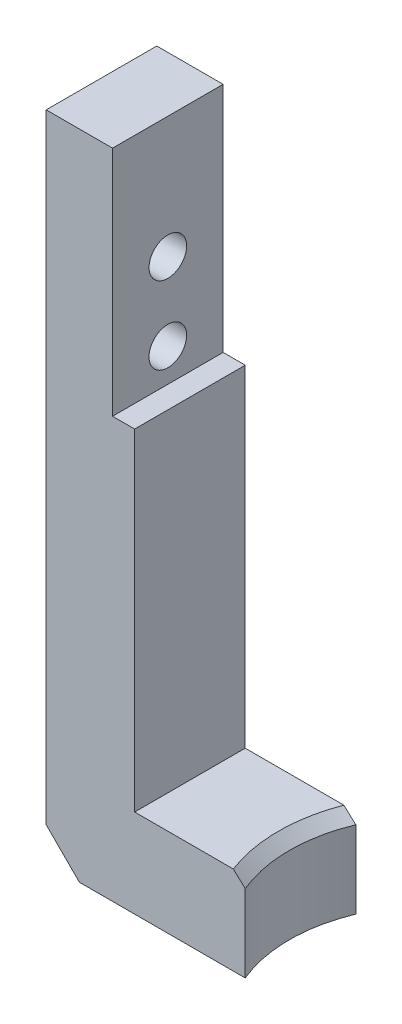
ISO-10303-21;
HEADER;
FILE_DESCRIPTION(('STEP AP214'),'2;1');
FILE_NAME('part.step','',(''),(''),'','','');
FILE_SCHEMA(('AUTOMOTIVE_DESIGN { 1 0 10303 214 1 1 1 1 }'));
ENDSEC;
DATA;
#1=APPLICATION_CONTEXT('core data for automotive mechanical design processes');
#2=APPLICATION_PROTOCOL_DEFINITION('international standard','automotive_design',2000,#1);
#3=PRODUCT_CONTEXT('',#1,'mechanical');
#4=PRODUCT('Part','Part','',(#3));
#5=PRODUCT_RELATED_PRODUCT_CATEGORY('part','',(#4));
#6=PRODUCT_DEFINITION_FORMATION('','',#4);
#7=PRODUCT_DEFINITION_CONTEXT('part definition',#1,'design');
#8=PRODUCT_DEFINITION('design','',#6,#7);
#9=PRODUCT_DEFINITION_SHAPE('','',#8);
#10=(LENGTH_UNIT() NAMED_UNIT(*) SI_UNIT(.MILLI.,.METRE.));
#11=(NAMED_UNIT(*) PLANE_ANGLE_UNIT() SI_UNIT($,.RADIAN.));
#12=(NAMED_UNIT(*) SI_UNIT($,.STERADIAN.) SOLID_ANGLE_UNIT());
#13=UNCERTAINTY_MEASURE_WITH_UNIT(LENGTH_MEASURE(1.E-05),#10,'distance_accuracy_value','');
#14=(GEOMETRIC_REPRESENTATION_CONTEXT(3) GLOBAL_UNCERTAINTY_ASSIGNED_CONTEXT((#13)) GLOBAL_UNIT_ASSIGNED_CONTEXT((#10,
#11,#12)) REPRESENTATION_CONTEXT('',''));
#15=CARTESIAN_POINT('',(0.,0.,0.));
#16=DIRECTION('',(0.,0.,1.));
#17=DIRECTION('',(1.,0.,0.));
#18=AXIS2_PLACEMENT_3D('',#15,#16,#17);
#19=CARTESIAN_POINT('',(0.,-8.,5.));
#20=DIRECTION('',(0.,1.,0.));
#21=DIRECTION('',(0.,0.,1.));
#22=AXIS2_PLACEMENT_3D('',#19,#20,#21);
#23=PLANE('',#22);
#24=DIRECTION('',(1.,0.,0.));
#25=VECTOR('',#24,1.);
#26=CARTESIAN_POINT('',(0.,-8.,5.));
#27=LINE('',#26,#25);
#28=CARTESIAN_POINT('',(3.,-8.,5.));
#29=VERTEX_POINT('',#28);
#30=CARTESIAN_POINT('',(18.,-8.,5.));
#31=VERTEX_POINT('',#30);
#32=EDGE_CURVE('E126',#29,#31,#27,.T.);
#33=ORIENTED_EDGE('',*,*,#32,.F.);
#34=DIRECTION('',(0.,0.,-1.));
#35=VECTOR('',#34,1.);
#36=CARTESIAN_POINT('',(3.,-8.,5.));
#37=LINE('',#36,#35);
#38=CARTESIAN_POINT('',(3.,-8.,-5.));
#39=VERTEX_POINT('',#38);
#40=EDGE_CURVE('E218',#29,#39,#37,.T.);
#41=ORIENTED_EDGE('',*,*,#40,.T.);
#42=DIRECTION('',(1.,0.,0.));
#43=VECTOR('',#42,1.);
#44=CARTESIAN_POINT('',(0.,-8.,-5.));
#45=LINE('',#44,#43);
#46=CARTESIAN_POINT('',(18.,-8.,-5.));
#47=VERTEX_POINT('',#46);
#48=EDGE_CURVE('E145',#39,#47,#45,.T.);
#49=ORIENTED_EDGE('',*,*,#48,.T.);
#50=CARTESIAN_POINT('',(30.,-8.,0.));
#51=DIRECTION('',(0.,-1.,0.));
#52=DIRECTION('',(0.,0.,-1.));
#53=AXIS2_PLACEMENT_3D('',#50,#51,#52);
#54=CIRCLE('',#53,13.);
#55=EDGE_CURVE('E143',#31,#47,#54,.T.);
#56=ORIENTED_EDGE('',*,*,#55,.F.);
#57=EDGE_LOOP('',(#33,#41,#49,#56));
#58=FACE_BOUND('',#57,.T.);
#59=ADVANCED_FACE('F45',(#58),#23,.F.);
#60=CARTESIAN_POINT('',(8.,0.,5.));
#61=DIRECTION('',(0.,-1.,0.));
#62=DIRECTION('',(0.,0.,-1.));
#63=AXIS2_PLACEMENT_3D('',#60,#61,#62);
#64=PLANE('',#63);
#65=DIRECTION('',(-1.,0.,0.));
#66=VECTOR('',#65,1.);
#67=CARTESIAN_POINT('',(8.,0.,5.));
#68=LINE('',#67,#66);
#69=CARTESIAN_POINT('',(16.923303169378,0.,5.));
#70=VERTEX_POINT('',#69);
#71=CARTESIAN_POINT('',(8.,0.,5.));
#72=VERTEX_POINT('',#71);
#73=EDGE_CURVE('E138',#70,#72,#68,.T.);
#74=ORIENTED_EDGE('',*,*,#73,.F.);
#75=CARTESIAN_POINT('',(30.,0.,0.));
#76=DIRECTION('',(0.,-1.,0.));
#77=DIRECTION('',(0.,0.,-1.));
#78=AXIS2_PLACEMENT_3D('',#75,#76,#77);
#79=CIRCLE('',#78,14.);
#80=CARTESIAN_POINT('',(16.923303169378,0.,-5.));
#81=VERTEX_POINT('',#80);
#82=EDGE_CURVE('E229',#70,#81,#79,.T.);
#83=ORIENTED_EDGE('',*,*,#82,.T.);
#84=DIRECTION('',(-1.,0.,0.));
#85=VECTOR('',#84,1.);
#86=CARTESIAN_POINT('',(8.,0.,-5.));
#87=LINE('',#86,#85);
#88=CARTESIAN_POINT('',(8.,0.,-5.));
#89=VERTEX_POINT('',#88);
#90=EDGE_CURVE('E178',#81,#89,#87,.T.);
#91=ORIENTED_EDGE('',*,*,#90,.T.);
#92=DIRECTION('',(0.,0.,-1.));
#93=VECTOR('',#92,1.);
#94=CARTESIAN_POINT('',(8.,0.,5.));
#95=LINE('',#94,#93);
#96=EDGE_CURVE('E211',#72,#89,#95,.T.);
#97=ORIENTED_EDGE('',*,*,#96,.F.);
#98=EDGE_LOOP('',(#74,#83,#91,#97));
#99=FACE_BOUND('',#98,.T.);
#100=ADVANCED_FACE('F266',(#99),#64,.F.);
#101=CARTESIAN_POINT('',(8.,0.,5.));
#102=DIRECTION('',(-1.,0.,0.));
#103=DIRECTION('',(0.,-1.,0.));
#104=AXIS2_PLACEMENT_3D('',#101,#102,#103);
#105=PLANE('',#104);
#106=DIRECTION('',(0.,1.,0.));
#107=VECTOR('',#106,1.);
#108=CARTESIAN_POINT('',(8.,0.,-5.));
#109=LINE('',#108,#107);
#110=CARTESIAN_POINT('',(7.99999999999999,30.,-5.));
#111=VERTEX_POINT('',#110);
#112=EDGE_CURVE('E181',#89,#111,#109,.T.);
#113=ORIENTED_EDGE('',*,*,#112,.T.);
#114=DIRECTION('',(0.,0.,-1.));
#115=VECTOR('',#114,1.);
#116=CARTESIAN_POINT('',(7.99999999999999,30.,5.));
#117=LINE('',#116,#115);
#118=CARTESIAN_POINT('',(7.99999999999999,30.,5.));
#119=VERTEX_POINT('',#118);
#120=EDGE_CURVE('E207',#119,#111,#117,.T.);
#121=ORIENTED_EDGE('',*,*,#120,.F.);
#122=DIRECTION('',(0.,1.,0.));
#123=VECTOR('',#122,1.);
#124=CARTESIAN_POINT('',(8.,0.,5.));
#125=LINE('',#124,#123);
#126=EDGE_CURVE('E162',#72,#119,#125,.T.);
#127=ORIENTED_EDGE('',*,*,#126,.F.);
#128=ORIENTED_EDGE('',*,*,#96,.T.);
#129=EDGE_LOOP('',(#113,#121,#127,#128));
#130=FACE_BOUND('',#129,.T.);
#131=ADVANCED_FACE('F262',(#130),#105,.F.);
#132=CARTESIAN_POINT('',(5.99999999999999,30.,5.));
#133=DIRECTION('',(0.,-1.,0.));
#134=DIRECTION('',(0.,0.,-1.));
#135=AXIS2_PLACEMENT_3D('',#132,#133,#134);
#136=PLANE('',#135);
#137=DIRECTION('',(-1.,0.,0.));
#138=VECTOR('',#137,1.);
#139=CARTESIAN_POINT('',(5.99999999999999,30.,-5.));
#140=LINE('',#139,#138);
#141=CARTESIAN_POINT('',(5.99999999999999,30.,-5.));
#142=VERTEX_POINT('',#141);
#143=EDGE_CURVE('E184',#111,#142,#140,.T.);
#144=ORIENTED_EDGE('',*,*,#143,.T.);
#145=DIRECTION('',(0.,0.,-1.));
#146=VECTOR('',#145,1.);
#147=CARTESIAN_POINT('',(5.99999999999999,30.,5.));
#148=LINE('',#147,#146);
#149=CARTESIAN_POINT('',(5.99999999999999,30.,5.));
#150=VERTEX_POINT('',#149);
#151=EDGE_CURVE('E203',#150,#142,#148,.T.);
#152=ORIENTED_EDGE('',*,*,#151,.F.);
#153=DIRECTION('',(-1.,0.,0.));
#154=VECTOR('',#153,1.);
#155=CARTESIAN_POINT('',(5.99999999999999,30.,5.));
#156=LINE('',#155,#154);
#157=EDGE_CURVE('E165',#119,#150,#156,.T.);
#158=ORIENTED_EDGE('',*,*,#157,.F.);
#159=ORIENTED_EDGE('',*,*,#120,.T.);
#160=EDGE_LOOP('',(#144,#152,#158,#159));
#161=FACE_BOUND('',#160,.T.);
#162=ADVANCED_FACE('F258',(#161),#136,.F.);
#163=CARTESIAN_POINT('',(5.99999999999999,30.,5.));
#164=DIRECTION('',(-1.,0.,0.));
#165=DIRECTION('',(0.,0.,1.));
#166=AXIS2_PLACEMENT_3D('',#163,#164,#165);
#167=PLANE('',#166);
#168=CARTESIAN_POINT('',(5.99999999999999,40.,0.));
#169=DIRECTION('',(-1.,0.,0.));
#170=DIRECTION('',(0.,0.,1.));
#171=AXIS2_PLACEMENT_3D('',#168,#169,#170);
#172=CIRCLE('',#171,1.7);
#173=CARTESIAN_POINT('',(5.99999999999999,40.,1.7));
#174=VERTEX_POINT('',#173);
#175=EDGE_CURVE('E51',#174,#174,#172,.T.);
#176=ORIENTED_EDGE('',*,*,#175,.T.);
#177=EDGE_LOOP('',(#176));
#178=FACE_BOUND('',#177,.T.);
#179=CARTESIAN_POINT('',(5.99999999999999,33.,0.));
#180=DIRECTION('',(-1.,0.,0.));
#181=DIRECTION('',(0.,0.,1.));
#182=AXIS2_PLACEMENT_3D('',#179,#180,#181);
#183=CIRCLE('',#182,1.7);
#184=CARTESIAN_POINT('',(5.99999999999999,33.,1.7));
#185=VERTEX_POINT('',#184);
#186=EDGE_CURVE('E149',#185,#185,#183,.T.);
#187=ORIENTED_EDGE('',*,*,#186,.T.);
#188=EDGE_LOOP('',(#187));
#189=FACE_BOUND('',#188,.T.);
#190=DIRECTION('',(0.,1.,0.));
#191=VECTOR('',#190,1.);
#192=CARTESIAN_POINT('',(5.99999999999999,30.,-5.));
#193=LINE('',#192,#191);
#194=CARTESIAN_POINT('',(5.99999999999999,51.,-5.));
#195=VERTEX_POINT('',#194);
#196=EDGE_CURVE('E187',#142,#195,#193,.T.);
#197=ORIENTED_EDGE('',*,*,#196,.T.);
#198=DIRECTION('',(0.,0.,-1.));
#199=VECTOR('',#198,1.);
#200=CARTESIAN_POINT('',(5.99999999999999,51.,5.));
#201=LINE('',#200,#199);
#202=CARTESIAN_POINT('',(5.99999999999999,51.,5.));
#203=VERTEX_POINT('',#202);
#204=EDGE_CURVE('E199',#203,#195,#201,.T.);
#205=ORIENTED_EDGE('',*,*,#204,.F.);
#206=DIRECTION('',(0.,1.,0.));
#207=VECTOR('',#206,1.);
#208=CARTESIAN_POINT('',(5.99999999999999,30.,5.));
#209=LINE('',#208,#207);
#210=EDGE_CURVE('E168',#150,#203,#209,.T.);
#211=ORIENTED_EDGE('',*,*,#210,.F.);
#212=ORIENTED_EDGE('',*,*,#151,.T.);
#213=EDGE_LOOP('',(#197,#205,#211,#212));
#214=FACE_BOUND('',#213,.T.);
#215=ADVANCED_FACE('F254',(#178,#189,#214),#167,.F.);
#216=CARTESIAN_POINT('',(0.,51.,5.));
#217=DIRECTION('',(0.,-1.,0.));
#218=DIRECTION('',(0.,0.,-1.));
#219=AXIS2_PLACEMENT_3D('',#216,#217,#218);
#220=PLANE('',#219);
#221=DIRECTION('',(-1.,0.,0.));
#222=VECTOR('',#221,1.);
#223=CARTESIAN_POINT('',(0.,51.,-5.));
#224=LINE('',#223,#222);
#225=CARTESIAN_POINT('',(0.,51.,-5.));
#226=VERTEX_POINT('',#225);
#227=EDGE_CURVE('E190',#195,#226,#224,.T.);
#228=ORIENTED_EDGE('',*,*,#227,.T.);
#229=DIRECTION('',(0.,0.,-1.));
#230=VECTOR('',#229,1.);
#231=CARTESIAN_POINT('',(0.,51.,5.));
#232=LINE('',#231,#230);
#233=CARTESIAN_POINT('',(0.,51.,5.));
#234=VERTEX_POINT('',#233);
#235=EDGE_CURVE('E175',#234,#226,#232,.T.);
#236=ORIENTED_EDGE('',*,*,#235,.F.);
#237=DIRECTION('',(-1.,0.,0.));
#238=VECTOR('',#237,1.);
#239=CARTESIAN_POINT('',(0.,51.,5.));
#240=LINE('',#239,#238);
#241=EDGE_CURVE('E171',#203,#234,#240,.T.);
#242=ORIENTED_EDGE('',*,*,#241,.F.);
#243=ORIENTED_EDGE('',*,*,#204,.T.);
#244=EDGE_LOOP('',(#228,#236,#242,#243));
#245=FACE_BOUND('',#244,.T.);
#246=ADVANCED_FACE('F250',(#245),#220,.F.);
#247=CARTESIAN_POINT('',(0.,30.,5.));
#248=DIRECTION('',(1.,0.,0.));
#249=DIRECTION('',(0.,0.,-1.));
#250=AXIS2_PLACEMENT_3D('',#247,#248,#249);
#251=PLANE('',#250);
#252=CARTESIAN_POINT('',(0.,40.,0.));
#253=DIRECTION('',(-1.,0.,0.));
#254=DIRECTION('',(0.,0.,1.));
#255=AXIS2_PLACEMENT_3D('',#252,#253,#254);
#256=CIRCLE('',#255,3.25);
#257=CARTESIAN_POINT('',(0.,40.,3.25));
#258=VERTEX_POINT('',#257);
#259=EDGE_CURVE('E337',#258,#258,#256,.T.);
#260=ORIENTED_EDGE('',*,*,#259,.F.);
#261=EDGE_LOOP('',(#260));
#262=FACE_BOUND('',#261,.T.);
#263=CARTESIAN_POINT('',(0.,33.,0.));
#264=DIRECTION('',(-1.,0.,0.));
#265=DIRECTION('',(0.,0.,1.));
#266=AXIS2_PLACEMENT_3D('',#263,#264,#265);
#267=CIRCLE('',#266,3.25);
#268=CARTESIAN_POINT('',(0.,33.,3.25));
#269=VERTEX_POINT('',#268);
#270=EDGE_CURVE('E347',#269,#269,#267,.T.);
#271=ORIENTED_EDGE('',*,*,#270,.F.);
#272=EDGE_LOOP('',(#271));
#273=FACE_BOUND('',#272,.T.);
#274=DIRECTION('',(0.,-1.,0.));
#275=VECTOR('',#274,1.);
#276=CARTESIAN_POINT('',(0.,30.,-5.));
#277=LINE('',#276,#275);
#278=CARTESIAN_POINT('',(0.,-4.99999999999998,-5.));
#279=VERTEX_POINT('',#278);
#280=EDGE_CURVE('E158',#226,#279,#277,.T.);
#281=ORIENTED_EDGE('',*,*,#280,.T.);
#282=DIRECTION('',(0.,0.,1.));
#283=VECTOR('',#282,1.);
#284=CARTESIAN_POINT('',(0.,-4.99999999999998,5.));
#285=LINE('',#284,#283);
#286=CARTESIAN_POINT('',(0.,-4.99999999999998,5.));
#287=VERTEX_POINT('',#286);
#288=EDGE_CURVE('E224',#279,#287,#285,.T.);
#289=ORIENTED_EDGE('',*,*,#288,.T.);
#290=DIRECTION('',(0.,-1.,0.));
#291=VECTOR('',#290,1.);
#292=CARTESIAN_POINT('',(0.,0.,5.));
#293=LINE('',#292,#291);
#294=EDGE_CURVE('E139',#234,#287,#293,.T.);
#295=ORIENTED_EDGE('',*,*,#294,.F.);
#296=ORIENTED_EDGE('',*,*,#235,.T.);
#297=EDGE_LOOP('',(#281,#289,#295,#296));
#298=FACE_BOUND('',#297,.T.);
#299=ADVANCED_FACE('F247',(#262,#273,#298),#251,.F.);
#300=CARTESIAN_POINT('',(0.,0.,5.));
#301=DIRECTION('',(0.,0.,-1.));
#302=DIRECTION('',(-1.,0.,0.));
#303=AXIS2_PLACEMENT_3D('',#300,#301,#302);
#304=PLANE('',#303);
#305=DIRECTION('',(0.,-1.,0.));
#306=VECTOR('',#305,1.);
#307=CARTESIAN_POINT('',(18.,2.,5.));
#308=LINE('',#307,#306);
#309=CARTESIAN_POINT('',(18.,-1.00000000000001,5.));
#310=VERTEX_POINT('',#309);
#311=EDGE_CURVE('E128',#31,#310,#308,.F.);
#312=ORIENTED_EDGE('',*,*,#311,.T.);
#313=CARTESIAN_POINT('',(18.,-1.00000000000001,5.));
#314=CARTESIAN_POINT('',(17.8200602591803,-0.833861175629415,5.));
#315=CARTESIAN_POINT('',(17.6403656457157,-0.667458423412528,5.));
#316=CARTESIAN_POINT('',(17.2814667022536,-0.334125089994601,5.));
#317=CARTESIAN_POINT('',(17.1022623721775,-0.167194508878149,5.));
#318=CARTESIAN_POINT('',(16.923303169378,0.,5.));
#319=B_SPLINE_CURVE_WITH_KNOTS('',3,(#313,#314,#315,#316,#317,#318),.UNSPECIFIED.,.F.,.F.,(4,2,
4),(0.,0.734724622210205,1.46944912668042),.UNSPECIFIED.);
#320=EDGE_CURVE('E11',#310,#70,#319,.T.);
#321=ORIENTED_EDGE('',*,*,#320,.T.);
#322=ORIENTED_EDGE('',*,*,#73,.T.);
#323=ORIENTED_EDGE('',*,*,#126,.T.);
#324=ORIENTED_EDGE('',*,*,#157,.T.);
#325=ORIENTED_EDGE('',*,*,#210,.T.);
#326=ORIENTED_EDGE('',*,*,#241,.T.);
#327=ORIENTED_EDGE('',*,*,#294,.T.);
#328=DIRECTION('',(-0.707106781186546,0.707106781186549,0.));
#329=VECTOR('',#328,1.);
#330=CARTESIAN_POINT('',(3.,-8.,5.));
#331=LINE('',#330,#329);
#332=EDGE_CURVE('E132',#287,#29,#331,.F.);
#333=ORIENTED_EDGE('',*,*,#332,.T.);
#334=ORIENTED_EDGE('',*,*,#32,.T.);
#335=EDGE_LOOP('',(#312,#321,#322,#323,#324,#325,#326,#327,#333,#334));
#336=FACE_BOUND('',#335,.T.);
#337=ADVANCED_FACE('F127',(#336),#304,.F.);
#338=CARTESIAN_POINT('',(0.,0.,-5.));
#339=DIRECTION('',(0.,0.,-1.));
#340=DIRECTION('',(-1.,0.,0.));
#341=AXIS2_PLACEMENT_3D('',#338,#339,#340);
#342=PLANE('',#341);
#343=ORIENTED_EDGE('',*,*,#90,.F.);
#344=CARTESIAN_POINT('',(16.923303169378,0.,-5.));
#345=CARTESIAN_POINT('',(17.1022623721775,-0.167194508878149,-5.));
#346=CARTESIAN_POINT('',(17.2814667022536,-0.334125089994601,-5.));
#347=CARTESIAN_POINT('',(17.6403656457157,-0.667458423412527,-5.));
#348=CARTESIAN_POINT('',(17.8200602591803,-0.833861175629413,-5.));
#349=CARTESIAN_POINT('',(18.,-1.00000000000001,-5.));
#350=B_SPLINE_CURVE_WITH_KNOTS('',3,(#344,#345,#346,#347,#348,#349),.UNSPECIFIED.,.F.,.F.,(4,2,
4),(0.,0.734724504470219,1.46944912668042),.UNSPECIFIED.);
#351=CARTESIAN_POINT('',(18.,-1.00000000000001,-5.));
#352=VERTEX_POINT('',#351);
#353=EDGE_CURVE('E72',#81,#352,#350,.T.);
#354=ORIENTED_EDGE('',*,*,#353,.T.);
#355=DIRECTION('',(0.,-1.,0.));
#356=VECTOR('',#355,1.);
#357=CARTESIAN_POINT('',(18.,2.,-5.));
#358=LINE('',#357,#356);
#359=EDGE_CURVE('E215',#47,#352,#358,.F.);
#360=ORIENTED_EDGE('',*,*,#359,.F.);
#361=ORIENTED_EDGE('',*,*,#48,.F.);
#362=DIRECTION('',(0.707106781186546,-0.707106781186549,0.));
#363=VECTOR('',#362,1.);
#364=CARTESIAN_POINT('',(-2.49999999999999,-2.49999999999998,-5.));
#365=LINE('',#364,#363);
#366=EDGE_CURVE('E221',#39,#279,#365,.F.);
#367=ORIENTED_EDGE('',*,*,#366,.T.);
#368=ORIENTED_EDGE('',*,*,#280,.F.);
#369=ORIENTED_EDGE('',*,*,#227,.F.);
#370=ORIENTED_EDGE('',*,*,#196,.F.);
#371=ORIENTED_EDGE('',*,*,#143,.F.);
#372=ORIENTED_EDGE('',*,*,#112,.F.);
#373=EDGE_LOOP('',(#343,#354,#360,#361,#367,#368,#369,#370,#371,#372));
#374=FACE_BOUND('',#373,.T.);
#375=ADVANCED_FACE('F240',(#374),#342,.T.);
#376=CARTESIAN_POINT('',(30.,2.,0.));
#377=DIRECTION('',(0.,-1.,0.));
#378=DIRECTION('',(0.,0.,-1.));
#379=AXIS2_PLACEMENT_3D('',#376,#377,#378);
#380=CYLINDRICAL_SURFACE('',#379,13.);
#381=ORIENTED_EDGE('',*,*,#359,.T.);
#382=CARTESIAN_POINT('',(30.,-1.00000000000001,0.));
#383=DIRECTION('',(0.,-1.,0.));
#384=DIRECTION('',(0.,0.,-1.));
#385=AXIS2_PLACEMENT_3D('',#382,#383,#384);
#386=CIRCLE('',#385,13.);
#387=EDGE_CURVE('E57',#352,#310,#386,.F.);
#388=ORIENTED_EDGE('',*,*,#387,.T.);
#389=ORIENTED_EDGE('',*,*,#311,.F.);
#390=ORIENTED_EDGE('',*,*,#55,.T.);
#391=EDGE_LOOP('',(#381,#388,#389,#390));
#392=FACE_BOUND('',#391,.T.);
#393=ADVANCED_FACE('F142',(#392),#380,.F.);
#394=CARTESIAN_POINT('',(3.,-8.,5.));
#395=DIRECTION('',(0.707106781186549,0.707106781186546,0.));
#396=DIRECTION('',(0.,0.,-1.));
#397=AXIS2_PLACEMENT_3D('',#394,#395,#396);
#398=PLANE('',#397);
#399=ORIENTED_EDGE('',*,*,#332,.F.);
#400=ORIENTED_EDGE('',*,*,#288,.F.);
#401=ORIENTED_EDGE('',*,*,#366,.F.);
#402=ORIENTED_EDGE('',*,*,#40,.F.);
#403=EDGE_LOOP('',(#399,#400,#401,#402));
#404=FACE_BOUND('',#403,.T.);
#405=ADVANCED_FACE('F273',(#404),#398,.F.);
#406=CARTESIAN_POINT('',(30.,0.,0.));
#407=DIRECTION('',(0.,1.,0.));
#408=DIRECTION('',(0.,0.,1.));
#409=AXIS2_PLACEMENT_3D('',#406,#407,#408);
#410=CONICAL_SURFACE('',#409,14.,0.785398163397445);
#411=ORIENTED_EDGE('',*,*,#320,.F.);
#412=ORIENTED_EDGE('',*,*,#387,.F.);
#413=ORIENTED_EDGE('',*,*,#353,.F.);
#414=ORIENTED_EDGE('',*,*,#82,.F.);
#415=EDGE_LOOP('',(#411,#412,#413,#414));
#416=FACE_BOUND('',#415,.T.);
#417=ADVANCED_FACE('F48',(#416),#410,.F.);
#418=CARTESIAN_POINT('',(0.,33.,0.));
#419=DIRECTION('',(-1.,0.,0.));
#420=DIRECTION('',(0.,0.,1.));
#421=AXIS2_PLACEMENT_3D('',#418,#419,#420);
#422=CYLINDRICAL_SURFACE('',#421,1.7);
#423=CARTESIAN_POINT('',(3.4,33.,0.));
#424=DIRECTION('',(-1.,0.,0.));
#425=DIRECTION('',(0.,0.,1.));
#426=AXIS2_PLACEMENT_3D('',#423,#424,#425);
#427=CIRCLE('',#426,1.7);
#428=CARTESIAN_POINT('',(3.4,33.,1.7));
#429=VERTEX_POINT('',#428);
#430=EDGE_CURVE('E153',#429,#429,#427,.T.);
#431=ORIENTED_EDGE('',*,*,#430,.T.);
#432=EDGE_LOOP('',(#431));
#433=FACE_BOUND('',#432,.T.);
#434=ORIENTED_EDGE('',*,*,#186,.F.);
#435=EDGE_LOOP('',(#434));
#436=FACE_BOUND('',#435,.T.);
#437=ADVANCED_FACE('F282',(#433,#436),#422,.F.);
#438=CARTESIAN_POINT('',(3.4,34.7,0.));
#439=DIRECTION('',(1.,0.,0.));
#440=DIRECTION('',(0.,0.,-1.));
#441=AXIS2_PLACEMENT_3D('',#438,#439,#440);
#442=PLANE('',#441);
#443=ORIENTED_EDGE('',*,*,#430,.F.);
#444=EDGE_LOOP('',(#443));
#445=FACE_BOUND('',#444,.T.);
#446=CARTESIAN_POINT('',(3.4,33.,0.));
#447=DIRECTION('',(-1.,0.,0.));
#448=DIRECTION('',(0.,0.,1.));
#449=AXIS2_PLACEMENT_3D('',#446,#447,#448);
#450=CIRCLE('',#449,3.25);
#451=CARTESIAN_POINT('',(3.4,33.,3.25));
#452=VERTEX_POINT('',#451);
#453=EDGE_CURVE('E350',#452,#452,#450,.T.);
#454=ORIENTED_EDGE('',*,*,#453,.T.);
#455=EDGE_LOOP('',(#454));
#456=FACE_BOUND('',#455,.T.);
#457=ADVANCED_FACE('F309',(#445,#456),#442,.F.);
#458=CARTESIAN_POINT('',(0.,33.,0.));
#459=DIRECTION('',(-1.,0.,0.));
#460=DIRECTION('',(0.,0.,1.));
#461=AXIS2_PLACEMENT_3D('',#458,#459,#460);
#462=CYLINDRICAL_SURFACE('',#461,3.25);
#463=ORIENTED_EDGE('',*,*,#453,.F.);
#464=EDGE_LOOP('',(#463));
#465=FACE_BOUND('',#464,.T.);
#466=ORIENTED_EDGE('',*,*,#270,.T.);
#467=EDGE_LOOP('',(#466));
#468=FACE_BOUND('',#467,.T.);
#469=ADVANCED_FACE('F313',(#465,#468),#462,.F.);
#470=CARTESIAN_POINT('',(0.,40.,0.));
#471=DIRECTION('',(-1.,0.,0.));
#472=DIRECTION('',(0.,0.,1.));
#473=AXIS2_PLACEMENT_3D('',#470,#471,#472);
#474=CYLINDRICAL_SURFACE('',#473,1.7);
#475=CARTESIAN_POINT('',(3.4,40.,0.));
#476=DIRECTION('',(-1.,0.,0.));
#477=DIRECTION('',(0.,0.,1.));
#478=AXIS2_PLACEMENT_3D('',#475,#476,#477);
#479=CIRCLE('',#478,1.7);
#480=CARTESIAN_POINT('',(3.4,40.,1.7));
#481=VERTEX_POINT('',#480);
#482=EDGE_CURVE('E341',#481,#481,#479,.T.);
#483=ORIENTED_EDGE('',*,*,#482,.T.);
#484=EDGE_LOOP('',(#483));
#485=FACE_BOUND('',#484,.T.);
#486=ORIENTED_EDGE('',*,*,#175,.F.);
#487=EDGE_LOOP('',(#486));
#488=FACE_BOUND('',#487,.T.);
#489=ADVANCED_FACE('F317',(#485,#488),#474,.F.);
#490=CARTESIAN_POINT('',(3.4,41.7,0.));
#491=DIRECTION('',(1.,0.,0.));
#492=DIRECTION('',(0.,0.,-1.));
#493=AXIS2_PLACEMENT_3D('',#490,#491,#492);
#494=PLANE('',#493);
#495=ORIENTED_EDGE('',*,*,#482,.F.);
#496=EDGE_LOOP('',(#495));
#497=FACE_BOUND('',#496,.T.);
#498=CARTESIAN_POINT('',(3.4,40.,0.));
#499=DIRECTION('',(-1.,0.,0.));
#500=DIRECTION('',(0.,0.,1.));
#501=AXIS2_PLACEMENT_3D('',#498,#499,#500);
#502=CIRCLE('',#501,3.25);
#503=CARTESIAN_POINT('',(3.4,40.,3.25));
#504=VERTEX_POINT('',#503);
#505=EDGE_CURVE('E334',#504,#504,#502,.T.);
#506=ORIENTED_EDGE('',*,*,#505,.T.);
#507=EDGE_LOOP('',(#506));
#508=FACE_BOUND('',#507,.T.);
#509=ADVANCED_FACE('F321',(#497,#508),#494,.F.);
#510=CARTESIAN_POINT('',(0.,40.,0.));
#511=DIRECTION('',(-1.,0.,0.));
#512=DIRECTION('',(0.,0.,1.));
#513=AXIS2_PLACEMENT_3D('',#510,#511,#512);
#514=CYLINDRICAL_SURFACE('',#513,3.25);
#515=ORIENTED_EDGE('',*,*,#505,.F.);
#516=EDGE_LOOP('',(#515));
#517=FACE_BOUND('',#516,.T.);
#518=ORIENTED_EDGE('',*,*,#259,.T.);
#519=EDGE_LOOP('',(#518));
#520=FACE_BOUND('',#519,.T.);
#521=ADVANCED_FACE('F325',(#517,#520),#514,.F.);
#522=CLOSED_SHELL('',(#59,#100,#131,#162,#215,#246,#299,#337,#375,#393,#405,#417,#437,#457,#469,
#489,#509,#521));
#523=MANIFOLD_SOLID_BREP('B2',#522);
#524=ADVANCED_BREP_SHAPE_REPRESENTATION('',(#18,#523),#14);
#525=SHAPE_DEFINITION_REPRESENTATION(#9,#524);
ENDSEC;
END-ISO-10303-21;
